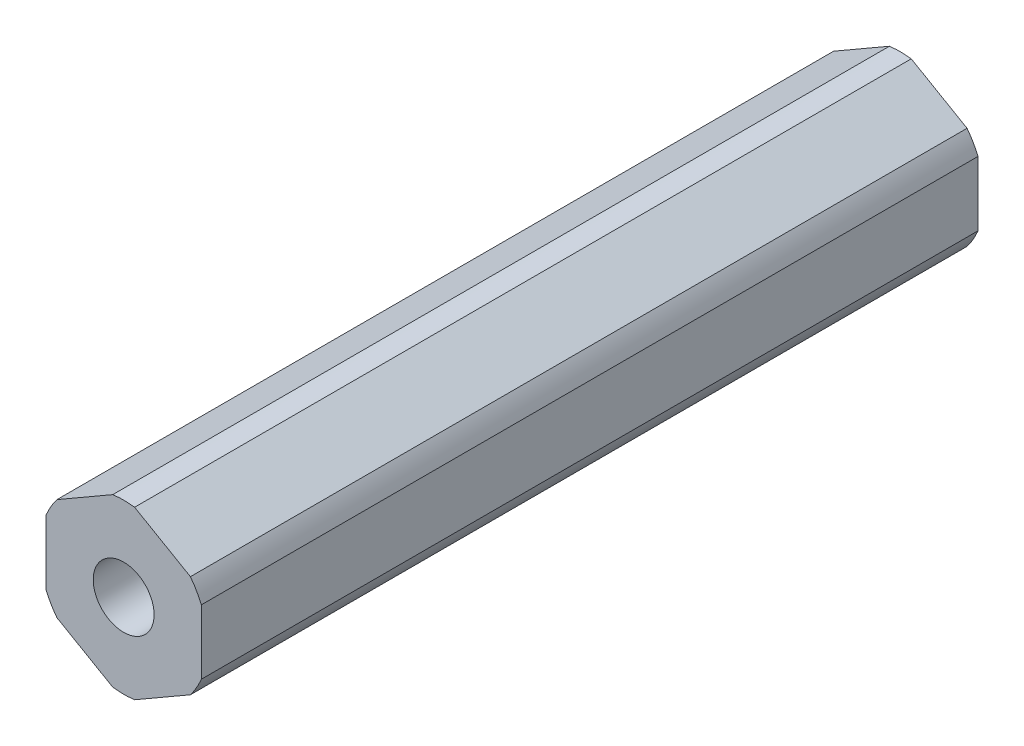
ISO-10303-21;
HEADER;
FILE_DESCRIPTION(('STEP AP214'),'2;1');
FILE_NAME('part.step','',(''),(''),'','','');
FILE_SCHEMA(('AUTOMOTIVE_DESIGN { 1 0 10303 214 1 1 1 1 }'));
ENDSEC;
DATA;
#1=APPLICATION_CONTEXT('core data for automotive mechanical design processes');
#2=APPLICATION_PROTOCOL_DEFINITION('international standard','automotive_design',2000,#1);
#3=PRODUCT_CONTEXT('',#1,'mechanical');
#4=PRODUCT('Part','Part','',(#3));
#5=PRODUCT_RELATED_PRODUCT_CATEGORY('part','',(#4));
#6=PRODUCT_DEFINITION_FORMATION('','',#4);
#7=PRODUCT_DEFINITION_CONTEXT('part definition',#1,'design');
#8=PRODUCT_DEFINITION('design','',#6,#7);
#9=PRODUCT_DEFINITION_SHAPE('','',#8);
#10=(LENGTH_UNIT() NAMED_UNIT(*) SI_UNIT(.MILLI.,.METRE.));
#11=(NAMED_UNIT(*) PLANE_ANGLE_UNIT() SI_UNIT($,.RADIAN.));
#12=(NAMED_UNIT(*) SI_UNIT($,.STERADIAN.) SOLID_ANGLE_UNIT());
#13=UNCERTAINTY_MEASURE_WITH_UNIT(LENGTH_MEASURE(1.E-05),#10,'distance_accuracy_value','');
#14=(GEOMETRIC_REPRESENTATION_CONTEXT(3) GLOBAL_UNCERTAINTY_ASSIGNED_CONTEXT((#13)) GLOBAL_UNIT_ASSIGNED_CONTEXT((#10,
#11,#12)) REPRESENTATION_CONTEXT('',''));
#15=CARTESIAN_POINT('',(0.,0.,0.));
#16=DIRECTION('',(0.,0.,1.));
#17=DIRECTION('',(1.,0.,0.));
#18=AXIS2_PLACEMENT_3D('',#15,#16,#17);
#19=CARTESIAN_POINT('',(0.,0.,31.75));
#20=DIRECTION('',(0.,0.,-1.));
#21=DIRECTION('',(-1.,0.,0.));
#22=AXIS2_PLACEMENT_3D('',#19,#20,#21);
#23=CYLINDRICAL_SURFACE('',#22,6.875);
#24=CARTESIAN_POINT('',(0.,0.,-31.75));
#25=DIRECTION('',(0.,0.,1.));
#26=DIRECTION('',(1.,0.,0.));
#27=AXIS2_PLACEMENT_3D('',#24,#25,#26);
#28=CIRCLE('',#27,6.875);
#29=CARTESIAN_POINT('',(0.893039494206792,6.81675182633099,-31.75));
#30=VERTEX_POINT('',#29);
#31=CARTESIAN_POINT('',(-0.893039494206789,6.81675182633099,-31.75));
#32=VERTEX_POINT('',#31);
#33=EDGE_CURVE('E156',#30,#32,#28,.T.);
#34=ORIENTED_EDGE('',*,*,#33,.T.);
#35=DIRECTION('',(0.,0.,-1.));
#36=VECTOR('',#35,1.);
#37=CARTESIAN_POINT('',(-0.893039494206789,6.81675182633099,31.75));
#38=LINE('',#37,#36);
#39=CARTESIAN_POINT('',(-0.893039494206789,6.81675182633099,31.75));
#40=VERTEX_POINT('',#39);
#41=EDGE_CURVE('E11',#40,#32,#38,.T.);
#42=ORIENTED_EDGE('',*,*,#41,.F.);
#43=CARTESIAN_POINT('',(0.,0.,31.75));
#44=DIRECTION('',(0.,0.,1.));
#45=DIRECTION('',(1.,0.,0.));
#46=AXIS2_PLACEMENT_3D('',#43,#44,#45);
#47=CIRCLE('',#46,6.875);
#48=CARTESIAN_POINT('',(0.893039494206792,6.81675182633099,31.75));
#49=VERTEX_POINT('',#48);
#50=EDGE_CURVE('E179',#49,#40,#47,.T.);
#51=ORIENTED_EDGE('',*,*,#50,.F.);
#52=DIRECTION('',(0.,0.,-1.));
#53=VECTOR('',#52,1.);
#54=CARTESIAN_POINT('',(0.893039494206792,6.81675182633099,31.75));
#55=LINE('',#54,#53);
#56=EDGE_CURVE('E152',#49,#30,#55,.T.);
#57=ORIENTED_EDGE('',*,*,#56,.T.);
#58=EDGE_LOOP('',(#34,#42,#51,#57));
#59=FACE_BOUND('',#58,.T.);
#60=ADVANCED_FACE('F36',(#59),#23,.T.);
#61=CARTESIAN_POINT('',(-0.893039494206789,6.81675182633099,31.75));
#62=DIRECTION('',(0.5,-0.866025403784439,0.));
#63=DIRECTION('',(0.866025403784439,0.5,0.));
#64=AXIS2_PLACEMENT_3D('',#61,#62,#63);
#65=PLANE('',#64);
#66=DIRECTION('',(-0.866025403784439,-0.5,0.));
#67=VECTOR('',#66,1.);
#68=CARTESIAN_POINT('',(-0.893039494206789,6.81675182633099,-31.75));
#69=LINE('',#68,#67);
#70=CARTESIAN_POINT('',(-5.45696050579321,4.18177080173138,-31.75));
#71=VERTEX_POINT('',#70);
#72=EDGE_CURVE('E159',#32,#71,#69,.T.);
#73=ORIENTED_EDGE('',*,*,#72,.T.);
#74=DIRECTION('',(0.,0.,-1.));
#75=VECTOR('',#74,1.);
#76=CARTESIAN_POINT('',(-5.45696050579321,4.18177080173138,31.75));
#77=LINE('',#76,#75);
#78=CARTESIAN_POINT('',(-5.45696050579321,4.18177080173138,31.75));
#79=VERTEX_POINT('',#78);
#80=EDGE_CURVE('E44',#79,#71,#77,.T.);
#81=ORIENTED_EDGE('',*,*,#80,.F.);
#82=DIRECTION('',(-0.866025403784439,-0.5,0.));
#83=VECTOR('',#82,1.);
#84=CARTESIAN_POINT('',(-0.893039494206789,6.81675182633099,31.75));
#85=LINE('',#84,#83);
#86=EDGE_CURVE('E107',#40,#79,#85,.T.);
#87=ORIENTED_EDGE('',*,*,#86,.F.);
#88=ORIENTED_EDGE('',*,*,#41,.T.);
#89=EDGE_LOOP('',(#73,#81,#87,#88));
#90=FACE_BOUND('',#89,.T.);
#91=ADVANCED_FACE('F258',(#90),#65,.F.);
#92=CARTESIAN_POINT('',(0.,0.,31.75));
#93=DIRECTION('',(0.,0.,-1.));
#94=DIRECTION('',(-1.,0.,0.));
#95=AXIS2_PLACEMENT_3D('',#92,#93,#94);
#96=CYLINDRICAL_SURFACE('',#95,6.875);
#97=CARTESIAN_POINT('',(0.,0.,-31.75));
#98=DIRECTION('',(0.,0.,1.));
#99=DIRECTION('',(1.,0.,0.));
#100=AXIS2_PLACEMENT_3D('',#97,#98,#99);
#101=CIRCLE('',#100,6.875);
#102=CARTESIAN_POINT('',(-6.35,2.63498102459961,-31.75));
#103=VERTEX_POINT('',#102);
#104=EDGE_CURVE('E162',#71,#103,#101,.T.);
#105=ORIENTED_EDGE('',*,*,#104,.T.);
#106=DIRECTION('',(0.,0.,-1.));
#107=VECTOR('',#106,1.);
#108=CARTESIAN_POINT('',(-6.35,2.63498102459961,31.75));
#109=LINE('',#108,#107);
#110=CARTESIAN_POINT('',(-6.35,2.63498102459961,31.75));
#111=VERTEX_POINT('',#110);
#112=EDGE_CURVE('E198',#111,#103,#109,.T.);
#113=ORIENTED_EDGE('',*,*,#112,.F.);
#114=CARTESIAN_POINT('',(0.,0.,31.75));
#115=DIRECTION('',(0.,0.,1.));
#116=DIRECTION('',(1.,0.,0.));
#117=AXIS2_PLACEMENT_3D('',#114,#115,#116);
#118=CIRCLE('',#117,6.875);
#119=EDGE_CURVE('E206',#79,#111,#118,.T.);
#120=ORIENTED_EDGE('',*,*,#119,.F.);
#121=ORIENTED_EDGE('',*,*,#80,.T.);
#122=EDGE_LOOP('',(#105,#113,#120,#121));
#123=FACE_BOUND('',#122,.T.);
#124=ADVANCED_FACE('F204',(#123),#96,.T.);
#125=CARTESIAN_POINT('',(-6.35,2.63498102459961,31.75));
#126=DIRECTION('',(1.,0.,0.));
#127=DIRECTION('',(0.,0.,-1.));
#128=AXIS2_PLACEMENT_3D('',#125,#126,#127);
#129=PLANE('',#128);
#130=DIRECTION('',(0.,-1.,0.));
#131=VECTOR('',#130,1.);
#132=CARTESIAN_POINT('',(-6.35,2.63498102459961,-31.75));
#133=LINE('',#132,#131);
#134=CARTESIAN_POINT('',(-6.35,-2.63498102459961,-31.75));
#135=VERTEX_POINT('',#134);
#136=EDGE_CURVE('E164',#103,#135,#133,.T.);
#137=ORIENTED_EDGE('',*,*,#136,.T.);
#138=DIRECTION('',(0.,0.,-1.));
#139=VECTOR('',#138,1.);
#140=CARTESIAN_POINT('',(-6.35,-2.63498102459961,31.75));
#141=LINE('',#140,#139);
#142=CARTESIAN_POINT('',(-6.35,-2.63498102459961,31.75));
#143=VERTEX_POINT('',#142);
#144=EDGE_CURVE('E195',#143,#135,#141,.T.);
#145=ORIENTED_EDGE('',*,*,#144,.F.);
#146=DIRECTION('',(0.,-1.,0.));
#147=VECTOR('',#146,1.);
#148=CARTESIAN_POINT('',(-6.35,2.63498102459961,31.75));
#149=LINE('',#148,#147);
#150=EDGE_CURVE('E224',#111,#143,#149,.T.);
#151=ORIENTED_EDGE('',*,*,#150,.F.);
#152=ORIENTED_EDGE('',*,*,#112,.T.);
#153=EDGE_LOOP('',(#137,#145,#151,#152));
#154=FACE_BOUND('',#153,.T.);
#155=ADVANCED_FACE('F215',(#154),#129,.F.);
#156=CARTESIAN_POINT('',(0.,0.,31.75));
#157=DIRECTION('',(0.,0.,-1.));
#158=DIRECTION('',(-1.,0.,0.));
#159=AXIS2_PLACEMENT_3D('',#156,#157,#158);
#160=CYLINDRICAL_SURFACE('',#159,6.875);
#161=CARTESIAN_POINT('',(0.,0.,-31.75));
#162=DIRECTION('',(0.,0.,1.));
#163=DIRECTION('',(1.,0.,0.));
#164=AXIS2_PLACEMENT_3D('',#161,#162,#163);
#165=CIRCLE('',#164,6.875);
#166=CARTESIAN_POINT('',(-5.45696050579321,-4.18177080173138,-31.75));
#167=VERTEX_POINT('',#166);
#168=EDGE_CURVE('E166',#135,#167,#165,.T.);
#169=ORIENTED_EDGE('',*,*,#168,.T.);
#170=DIRECTION('',(0.,0.,-1.));
#171=VECTOR('',#170,1.);
#172=CARTESIAN_POINT('',(-5.45696050579321,-4.18177080173138,31.75));
#173=LINE('',#172,#171);
#174=CARTESIAN_POINT('',(-5.45696050579321,-4.18177080173138,31.75));
#175=VERTEX_POINT('',#174);
#176=EDGE_CURVE('E192',#175,#167,#173,.T.);
#177=ORIENTED_EDGE('',*,*,#176,.F.);
#178=CARTESIAN_POINT('',(0.,0.,31.75));
#179=DIRECTION('',(0.,0.,1.));
#180=DIRECTION('',(1.,0.,0.));
#181=AXIS2_PLACEMENT_3D('',#178,#179,#180);
#182=CIRCLE('',#181,6.875);
#183=EDGE_CURVE('E221',#143,#175,#182,.T.);
#184=ORIENTED_EDGE('',*,*,#183,.F.);
#185=ORIENTED_EDGE('',*,*,#144,.T.);
#186=EDGE_LOOP('',(#169,#177,#184,#185));
#187=FACE_BOUND('',#186,.T.);
#188=ADVANCED_FACE('F219',(#187),#160,.T.);
#189=CARTESIAN_POINT('',(-5.45696050579321,-4.18177080173138,31.75));
#190=DIRECTION('',(0.5,0.866025403784439,0.));
#191=DIRECTION('',(-0.866025403784439,0.5,0.));
#192=AXIS2_PLACEMENT_3D('',#189,#190,#191);
#193=PLANE('',#192);
#194=DIRECTION('',(0.866025403784439,-0.5,0.));
#195=VECTOR('',#194,1.);
#196=CARTESIAN_POINT('',(-5.45696050579321,-4.18177080173138,-31.75));
#197=LINE('',#196,#195);
#198=CARTESIAN_POINT('',(-0.893039494206789,-6.81675182633099,-31.75));
#199=VERTEX_POINT('',#198);
#200=EDGE_CURVE('E168',#167,#199,#197,.T.);
#201=ORIENTED_EDGE('',*,*,#200,.T.);
#202=DIRECTION('',(0.,0.,-1.));
#203=VECTOR('',#202,1.);
#204=CARTESIAN_POINT('',(-0.893039494206789,-6.81675182633099,31.75));
#205=LINE('',#204,#203);
#206=CARTESIAN_POINT('',(-0.893039494206789,-6.81675182633099,31.75));
#207=VERTEX_POINT('',#206);
#208=EDGE_CURVE('E189',#207,#199,#205,.T.);
#209=ORIENTED_EDGE('',*,*,#208,.F.);
#210=DIRECTION('',(0.866025403784439,-0.5,0.));
#211=VECTOR('',#210,1.);
#212=CARTESIAN_POINT('',(-5.45696050579321,-4.18177080173138,31.75));
#213=LINE('',#212,#211);
#214=EDGE_CURVE('E223',#175,#207,#213,.T.);
#215=ORIENTED_EDGE('',*,*,#214,.F.);
#216=ORIENTED_EDGE('',*,*,#176,.T.);
#217=EDGE_LOOP('',(#201,#209,#215,#216));
#218=FACE_BOUND('',#217,.T.);
#219=ADVANCED_FACE('F271',(#218),#193,.F.);
#220=CARTESIAN_POINT('',(0.,0.,31.75));
#221=DIRECTION('',(0.,0.,-1.));
#222=DIRECTION('',(-1.,0.,0.));
#223=AXIS2_PLACEMENT_3D('',#220,#221,#222);
#224=CYLINDRICAL_SURFACE('',#223,6.875);
#225=CARTESIAN_POINT('',(0.,0.,-31.75));
#226=DIRECTION('',(0.,0.,1.));
#227=DIRECTION('',(1.,0.,0.));
#228=AXIS2_PLACEMENT_3D('',#225,#226,#227);
#229=CIRCLE('',#228,6.875);
#230=CARTESIAN_POINT('',(0.893039494206785,-6.81675182633099,-31.75));
#231=VERTEX_POINT('',#230);
#232=EDGE_CURVE('E170',#199,#231,#229,.T.);
#233=ORIENTED_EDGE('',*,*,#232,.T.);
#234=DIRECTION('',(0.,0.,-1.));
#235=VECTOR('',#234,1.);
#236=CARTESIAN_POINT('',(0.893039494206785,-6.81675182633099,31.75));
#237=LINE('',#236,#235);
#238=CARTESIAN_POINT('',(0.893039494206785,-6.81675182633099,31.75));
#239=VERTEX_POINT('',#238);
#240=EDGE_CURVE('E186',#239,#231,#237,.T.);
#241=ORIENTED_EDGE('',*,*,#240,.F.);
#242=CARTESIAN_POINT('',(0.,0.,31.75));
#243=DIRECTION('',(0.,0.,1.));
#244=DIRECTION('',(1.,0.,0.));
#245=AXIS2_PLACEMENT_3D('',#242,#243,#244);
#246=CIRCLE('',#245,6.875);
#247=EDGE_CURVE('E226',#207,#239,#246,.T.);
#248=ORIENTED_EDGE('',*,*,#247,.F.);
#249=ORIENTED_EDGE('',*,*,#208,.T.);
#250=EDGE_LOOP('',(#233,#241,#248,#249));
#251=FACE_BOUND('',#250,.T.);
#252=ADVANCED_FACE('F274',(#251),#224,.T.);
#253=CARTESIAN_POINT('',(0.893039494206788,-6.81675182633099,31.75));
#254=DIRECTION('',(-0.5,0.866025403784439,0.));
#255=DIRECTION('',(-0.866025403784439,-0.5,0.));
#256=AXIS2_PLACEMENT_3D('',#253,#254,#255);
#257=PLANE('',#256);
#258=DIRECTION('',(0.866025403784439,0.5,0.));
#259=VECTOR('',#258,1.);
#260=CARTESIAN_POINT('',(0.893039494206788,-6.81675182633099,-31.75));
#261=LINE('',#260,#259);
#262=CARTESIAN_POINT('',(5.45696050579321,-4.18177080173138,-31.75));
#263=VERTEX_POINT('',#262);
#264=EDGE_CURVE('E172',#231,#263,#261,.T.);
#265=ORIENTED_EDGE('',*,*,#264,.T.);
#266=DIRECTION('',(0.,0.,-1.));
#267=VECTOR('',#266,1.);
#268=CARTESIAN_POINT('',(5.45696050579321,-4.18177080173138,31.75));
#269=LINE('',#268,#267);
#270=CARTESIAN_POINT('',(5.45696050579321,-4.18177080173138,31.75));
#271=VERTEX_POINT('',#270);
#272=EDGE_CURVE('E183',#271,#263,#269,.T.);
#273=ORIENTED_EDGE('',*,*,#272,.F.);
#274=DIRECTION('',(0.866025403784439,0.5,0.));
#275=VECTOR('',#274,1.);
#276=CARTESIAN_POINT('',(0.893039494206788,-6.81675182633099,31.75));
#277=LINE('',#276,#275);
#278=EDGE_CURVE('E232',#239,#271,#277,.T.);
#279=ORIENTED_EDGE('',*,*,#278,.F.);
#280=ORIENTED_EDGE('',*,*,#240,.T.);
#281=EDGE_LOOP('',(#265,#273,#279,#280));
#282=FACE_BOUND('',#281,.T.);
#283=ADVANCED_FACE('F238',(#282),#257,.F.);
#284=CARTESIAN_POINT('',(0.,0.,31.75));
#285=DIRECTION('',(0.,0.,-1.));
#286=DIRECTION('',(-1.,0.,0.));
#287=AXIS2_PLACEMENT_3D('',#284,#285,#286);
#288=CYLINDRICAL_SURFACE('',#287,6.875);
#289=CARTESIAN_POINT('',(0.,0.,-31.75));
#290=DIRECTION('',(0.,0.,1.));
#291=DIRECTION('',(1.,0.,0.));
#292=AXIS2_PLACEMENT_3D('',#289,#290,#291);
#293=CIRCLE('',#292,6.875);
#294=CARTESIAN_POINT('',(6.34999999999999,-2.63498102459962,-31.75));
#295=VERTEX_POINT('',#294);
#296=EDGE_CURVE('E174',#263,#295,#293,.T.);
#297=ORIENTED_EDGE('',*,*,#296,.T.);
#298=DIRECTION('',(0.,0.,-1.));
#299=VECTOR('',#298,1.);
#300=CARTESIAN_POINT('',(6.34999999999999,-2.63498102459962,31.75));
#301=LINE('',#300,#299);
#302=CARTESIAN_POINT('',(6.34999999999999,-2.63498102459962,31.75));
#303=VERTEX_POINT('',#302);
#304=EDGE_CURVE('E147',#303,#295,#301,.T.);
#305=ORIENTED_EDGE('',*,*,#304,.F.);
#306=CARTESIAN_POINT('',(0.,0.,31.75));
#307=DIRECTION('',(0.,0.,1.));
#308=DIRECTION('',(1.,0.,0.));
#309=AXIS2_PLACEMENT_3D('',#306,#307,#308);
#310=CIRCLE('',#309,6.875);
#311=EDGE_CURVE('E138',#271,#303,#310,.T.);
#312=ORIENTED_EDGE('',*,*,#311,.F.);
#313=ORIENTED_EDGE('',*,*,#272,.T.);
#314=EDGE_LOOP('',(#297,#305,#312,#313));
#315=FACE_BOUND('',#314,.T.);
#316=ADVANCED_FACE('F242',(#315),#288,.T.);
#317=CARTESIAN_POINT('',(6.34999999999999,-2.63498102459962,31.75));
#318=DIRECTION('',(-1.,0.,0.));
#319=DIRECTION('',(0.,0.,1.));
#320=AXIS2_PLACEMENT_3D('',#317,#318,#319);
#321=PLANE('',#320);
#322=DIRECTION('',(0.,1.,0.));
#323=VECTOR('',#322,1.);
#324=CARTESIAN_POINT('',(6.34999999999999,-2.63498102459962,-31.75));
#325=LINE('',#324,#323);
#326=CARTESIAN_POINT('',(6.34999999999999,2.63498102459962,-31.75));
#327=VERTEX_POINT('',#326);
#328=EDGE_CURVE('E146',#295,#327,#325,.T.);
#329=ORIENTED_EDGE('',*,*,#328,.T.);
#330=DIRECTION('',(0.,0.,-1.));
#331=VECTOR('',#330,1.);
#332=CARTESIAN_POINT('',(6.34999999999999,2.63498102459962,31.75));
#333=LINE('',#332,#331);
#334=CARTESIAN_POINT('',(6.34999999999999,2.63498102459962,31.75));
#335=VERTEX_POINT('',#334);
#336=EDGE_CURVE('E143',#335,#327,#333,.T.);
#337=ORIENTED_EDGE('',*,*,#336,.F.);
#338=DIRECTION('',(0.,1.,0.));
#339=VECTOR('',#338,1.);
#340=CARTESIAN_POINT('',(6.34999999999999,-2.63498102459962,31.75));
#341=LINE('',#340,#339);
#342=EDGE_CURVE('E132',#303,#335,#341,.T.);
#343=ORIENTED_EDGE('',*,*,#342,.F.);
#344=ORIENTED_EDGE('',*,*,#304,.T.);
#345=EDGE_LOOP('',(#329,#337,#343,#344));
#346=FACE_BOUND('',#345,.T.);
#347=ADVANCED_FACE('F144',(#346),#321,.F.);
#348=CARTESIAN_POINT('',(0.,0.,31.75));
#349=DIRECTION('',(0.,0.,-1.));
#350=DIRECTION('',(-1.,0.,0.));
#351=AXIS2_PLACEMENT_3D('',#348,#349,#350);
#352=CYLINDRICAL_SURFACE('',#351,6.875);
#353=CARTESIAN_POINT('',(0.,0.,-31.75));
#354=DIRECTION('',(0.,0.,1.));
#355=DIRECTION('',(1.,0.,0.));
#356=AXIS2_PLACEMENT_3D('',#353,#354,#355);
#357=CIRCLE('',#356,6.875);
#358=CARTESIAN_POINT('',(5.45696050579321,4.18177080173139,-31.75));
#359=VERTEX_POINT('',#358);
#360=EDGE_CURVE('E93',#327,#359,#357,.T.);
#361=ORIENTED_EDGE('',*,*,#360,.T.);
#362=DIRECTION('',(0.,0.,-1.));
#363=VECTOR('',#362,1.);
#364=CARTESIAN_POINT('',(5.45696050579321,4.18177080173139,31.75));
#365=LINE('',#364,#363);
#366=CARTESIAN_POINT('',(5.45696050579321,4.18177080173139,31.75));
#367=VERTEX_POINT('',#366);
#368=EDGE_CURVE('E148',#367,#359,#365,.T.);
#369=ORIENTED_EDGE('',*,*,#368,.F.);
#370=CARTESIAN_POINT('',(0.,0.,31.75));
#371=DIRECTION('',(0.,0.,1.));
#372=DIRECTION('',(1.,0.,0.));
#373=AXIS2_PLACEMENT_3D('',#370,#371,#372);
#374=CIRCLE('',#373,6.875);
#375=EDGE_CURVE('E136',#335,#367,#374,.T.);
#376=ORIENTED_EDGE('',*,*,#375,.F.);
#377=ORIENTED_EDGE('',*,*,#336,.T.);
#378=EDGE_LOOP('',(#361,#369,#376,#377));
#379=FACE_BOUND('',#378,.T.);
#380=ADVANCED_FACE('F150',(#379),#352,.T.);
#381=CARTESIAN_POINT('',(5.45696050579321,4.18177080173138,31.75));
#382=DIRECTION('',(-0.499999999999999,-0.866025403784439,0.));
#383=DIRECTION('',(0.866025403784439,-0.5,0.));
#384=AXIS2_PLACEMENT_3D('',#381,#382,#383);
#385=PLANE('',#384);
#386=DIRECTION('',(-0.866025403784439,0.5,0.));
#387=VECTOR('',#386,1.);
#388=CARTESIAN_POINT('',(5.45696050579321,4.18177080173138,-31.75));
#389=LINE('',#388,#387);
#390=EDGE_CURVE('E99',#359,#30,#389,.T.);
#391=ORIENTED_EDGE('',*,*,#390,.T.);
#392=ORIENTED_EDGE('',*,*,#56,.F.);
#393=DIRECTION('',(-0.866025403784439,0.5,0.));
#394=VECTOR('',#393,1.);
#395=CARTESIAN_POINT('',(5.45696050579321,4.18177080173138,31.75));
#396=LINE('',#395,#394);
#397=EDGE_CURVE('E52',#367,#49,#396,.T.);
#398=ORIENTED_EDGE('',*,*,#397,.F.);
#399=ORIENTED_EDGE('',*,*,#368,.T.);
#400=EDGE_LOOP('',(#391,#392,#398,#399));
#401=FACE_BOUND('',#400,.T.);
#402=ADVANCED_FACE('F246',(#401),#385,.F.);
#403=CARTESIAN_POINT('',(0.,0.,31.75));
#404=DIRECTION('',(0.,0.,1.));
#405=DIRECTION('',(1.,0.,0.));
#406=AXIS2_PLACEMENT_3D('',#403,#404,#405);
#407=PLANE('',#406);
#408=CARTESIAN_POINT('',(0.,0.,31.75));
#409=DIRECTION('',(0.,0.,1.));
#410=DIRECTION('',(1.,0.,0.));
#411=AXIS2_PLACEMENT_3D('',#408,#409,#410);
#412=CIRCLE('',#411,2.4892);
#413=CARTESIAN_POINT('',(2.4892,0.,31.75));
#414=VERTEX_POINT('',#413);
#415=EDGE_CURVE('E409',#414,#414,#412,.T.);
#416=ORIENTED_EDGE('',*,*,#415,.F.);
#417=EDGE_LOOP('',(#416));
#418=FACE_BOUND('',#417,.T.);
#419=ORIENTED_EDGE('',*,*,#50,.T.);
#420=ORIENTED_EDGE('',*,*,#86,.T.);
#421=ORIENTED_EDGE('',*,*,#119,.T.);
#422=ORIENTED_EDGE('',*,*,#150,.T.);
#423=ORIENTED_EDGE('',*,*,#183,.T.);
#424=ORIENTED_EDGE('',*,*,#214,.T.);
#425=ORIENTED_EDGE('',*,*,#247,.T.);
#426=ORIENTED_EDGE('',*,*,#278,.T.);
#427=ORIENTED_EDGE('',*,*,#311,.T.);
#428=ORIENTED_EDGE('',*,*,#342,.T.);
#429=ORIENTED_EDGE('',*,*,#375,.T.);
#430=ORIENTED_EDGE('',*,*,#397,.T.);
#431=EDGE_LOOP('',(#419,#420,#421,#422,#423,#424,#425,#426,#427,#428,#429,#430));
#432=FACE_BOUND('',#431,.T.);
#433=ADVANCED_FACE('F134',(#418,#432),#407,.T.);
#434=CARTESIAN_POINT('',(0.,0.,-31.75));
#435=DIRECTION('',(0.,0.,1.));
#436=DIRECTION('',(1.,0.,0.));
#437=AXIS2_PLACEMENT_3D('',#434,#435,#436);
#438=PLANE('',#437);
#439=CARTESIAN_POINT('',(0.,0.,-31.75));
#440=DIRECTION('',(0.,0.,1.));
#441=DIRECTION('',(1.,0.,0.));
#442=AXIS2_PLACEMENT_3D('',#439,#440,#441);
#443=CIRCLE('',#442,2.4892);
#444=CARTESIAN_POINT('',(2.4892,0.,-31.75));
#445=VERTEX_POINT('',#444);
#446=EDGE_CURVE('E160',#445,#445,#443,.T.);
#447=ORIENTED_EDGE('',*,*,#446,.T.);
#448=EDGE_LOOP('',(#447));
#449=FACE_BOUND('',#448,.T.);
#450=ORIENTED_EDGE('',*,*,#33,.F.);
#451=ORIENTED_EDGE('',*,*,#390,.F.);
#452=ORIENTED_EDGE('',*,*,#360,.F.);
#453=ORIENTED_EDGE('',*,*,#328,.F.);
#454=ORIENTED_EDGE('',*,*,#296,.F.);
#455=ORIENTED_EDGE('',*,*,#264,.F.);
#456=ORIENTED_EDGE('',*,*,#232,.F.);
#457=ORIENTED_EDGE('',*,*,#200,.F.);
#458=ORIENTED_EDGE('',*,*,#168,.F.);
#459=ORIENTED_EDGE('',*,*,#136,.F.);
#460=ORIENTED_EDGE('',*,*,#104,.F.);
#461=ORIENTED_EDGE('',*,*,#72,.F.);
#462=EDGE_LOOP('',(#450,#451,#452,#453,#454,#455,#456,#457,#458,#459,#460,#461));
#463=FACE_BOUND('',#462,.T.);
#464=ADVANCED_FACE('F210',(#449,#463),#438,.F.);
#465=CARTESIAN_POINT('',(0.,0.,-31.75));
#466=DIRECTION('',(0.,0.,1.));
#467=DIRECTION('',(1.,0.,0.));
#468=AXIS2_PLACEMENT_3D('',#465,#466,#467);
#469=CYLINDRICAL_SURFACE('',#468,2.4892);
#470=ORIENTED_EDGE('',*,*,#446,.F.);
#471=EDGE_LOOP('',(#470));
#472=FACE_BOUND('',#471,.T.);
#473=ORIENTED_EDGE('',*,*,#415,.T.);
#474=EDGE_LOOP('',(#473));
#475=FACE_BOUND('',#474,.T.);
#476=ADVANCED_FACE('F314',(#472,#475),#469,.F.);
#477=CLOSED_SHELL('',(#60,#91,#124,#155,#188,#219,#252,#283,#316,#347,#380,#402,#433,#464,#476));
#478=MANIFOLD_SOLID_BREP('B2',#477);
#479=ADVANCED_BREP_SHAPE_REPRESENTATION('',(#18,#478),#14);
#480=SHAPE_DEFINITION_REPRESENTATION(#9,#479);
ENDSEC;
END-ISO-10303-21;
